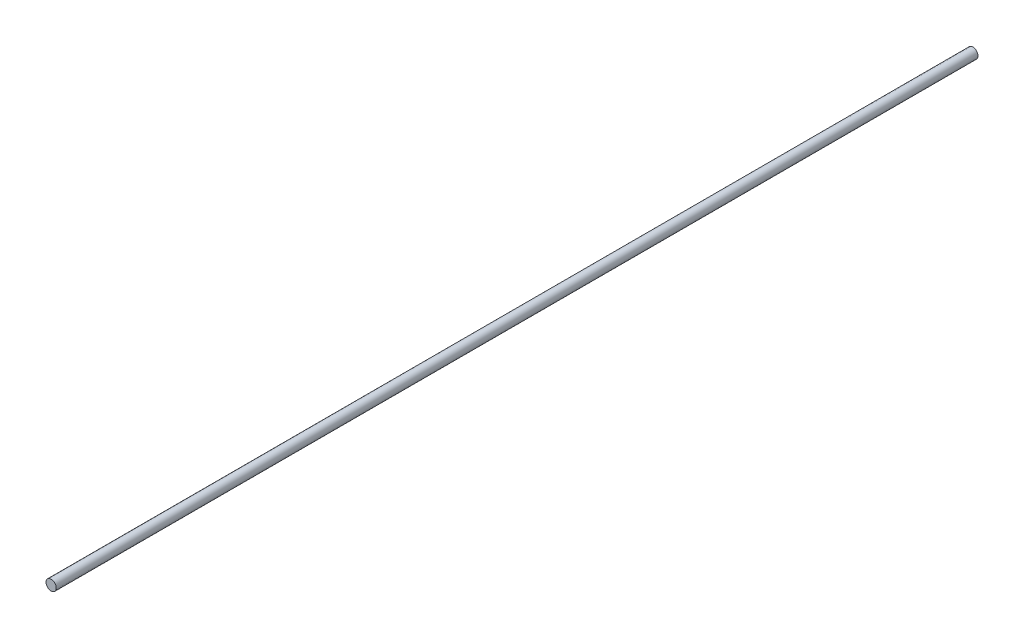
ISO-10303-21;
HEADER;
FILE_DESCRIPTION(('STEP AP214'),'2;1');
FILE_NAME('part.step','',(''),(''),'','','');
FILE_SCHEMA(('AUTOMOTIVE_DESIGN { 1 0 10303 214 1 1 1 1 }'));
ENDSEC;
DATA;
#1=APPLICATION_CONTEXT('core data for automotive mechanical design processes');
#2=APPLICATION_PROTOCOL_DEFINITION('international standard','automotive_design',2000,#1);
#3=PRODUCT_CONTEXT('',#1,'mechanical');
#4=PRODUCT('Part','Part','',(#3));
#5=PRODUCT_RELATED_PRODUCT_CATEGORY('part','',(#4));
#6=PRODUCT_DEFINITION_FORMATION('','',#4);
#7=PRODUCT_DEFINITION_CONTEXT('part definition',#1,'design');
#8=PRODUCT_DEFINITION('design','',#6,#7);
#9=PRODUCT_DEFINITION_SHAPE('','',#8);
#10=(LENGTH_UNIT() NAMED_UNIT(*) SI_UNIT(.MILLI.,.METRE.));
#11=(NAMED_UNIT(*) PLANE_ANGLE_UNIT() SI_UNIT($,.RADIAN.));
#12=(NAMED_UNIT(*) SI_UNIT($,.STERADIAN.) SOLID_ANGLE_UNIT());
#13=UNCERTAINTY_MEASURE_WITH_UNIT(LENGTH_MEASURE(1.E-05),#10,'distance_accuracy_value','');
#14=(GEOMETRIC_REPRESENTATION_CONTEXT(3) GLOBAL_UNCERTAINTY_ASSIGNED_CONTEXT((#13)) GLOBAL_UNIT_ASSIGNED_CONTEXT((#10,
#11,#12)) REPRESENTATION_CONTEXT('',''));
#15=CARTESIAN_POINT('',(0.,0.,0.));
#16=DIRECTION('',(0.,0.,1.));
#17=DIRECTION('',(1.,0.,0.));
#18=AXIS2_PLACEMENT_3D('',#15,#16,#17);
#19=CARTESIAN_POINT('',(0.,0.,180.));
#20=DIRECTION('',(0.,0.,-1.));
#21=DIRECTION('',(-1.,0.,0.));
#22=AXIS2_PLACEMENT_3D('',#19,#20,#21);
#23=CYLINDRICAL_SURFACE('',#22,1.);
#24=CARTESIAN_POINT('',(0.,0.,180.));
#25=DIRECTION('',(0.,0.,1.));
#26=DIRECTION('',(1.,0.,0.));
#27=AXIS2_PLACEMENT_3D('',#24,#25,#26);
#28=CIRCLE('',#27,1.);
#29=CARTESIAN_POINT('',(-1.,0.,180.));
#30=VERTEX_POINT('',#29);
#31=EDGE_CURVE('E10',#30,#30,#28,.T.);
#32=CARTESIAN_POINT('',(0.,0.,0.));
#33=DIRECTION('',(0.,0.,1.));
#34=DIRECTION('',(1.,0.,0.));
#35=AXIS2_PLACEMENT_3D('',#32,#33,#34);
#36=CIRCLE('',#35,1.);
#37=CARTESIAN_POINT('',(-1.,0.,0.));
#38=VERTEX_POINT('',#37);
#39=EDGE_CURVE('E38',#38,#38,#36,.T.);
#40=CARTESIAN_POINT('',(-1.,0.,180.));
#41=CARTESIAN_POINT('',(-1.,0.,178.125));
#42=CARTESIAN_POINT('',(-1.,0.,176.25));
#43=CARTESIAN_POINT('',(-1.,0.,172.5));
#44=CARTESIAN_POINT('',(-1.,0.,170.625));
#45=CARTESIAN_POINT('',(-1.,0.,166.875));
#46=CARTESIAN_POINT('',(-1.,0.,165.));
#47=CARTESIAN_POINT('',(-1.,0.,161.25));
#48=CARTESIAN_POINT('',(-1.,0.,159.375));
#49=CARTESIAN_POINT('',(-1.,0.,155.625));
#50=CARTESIAN_POINT('',(-1.,0.,153.75));
#51=CARTESIAN_POINT('',(-1.,0.,150.));
#52=CARTESIAN_POINT('',(-1.,0.,148.125));
#53=CARTESIAN_POINT('',(-1.,0.,144.375));
#54=CARTESIAN_POINT('',(-1.,0.,142.5));
#55=CARTESIAN_POINT('',(-1.,0.,138.75));
#56=CARTESIAN_POINT('',(-1.,0.,136.875));
#57=CARTESIAN_POINT('',(-1.,0.,133.125));
#58=CARTESIAN_POINT('',(-1.,0.,131.25));
#59=CARTESIAN_POINT('',(-1.,0.,127.5));
#60=CARTESIAN_POINT('',(-1.,0.,125.625));
#61=CARTESIAN_POINT('',(-1.,0.,121.875));
#62=CARTESIAN_POINT('',(-1.,0.,120.));
#63=CARTESIAN_POINT('',(-1.,0.,116.25));
#64=CARTESIAN_POINT('',(-1.,0.,114.375));
#65=CARTESIAN_POINT('',(-1.,0.,110.625));
#66=CARTESIAN_POINT('',(-1.,0.,108.75));
#67=CARTESIAN_POINT('',(-1.,0.,105.));
#68=CARTESIAN_POINT('',(-1.,0.,103.125));
#69=CARTESIAN_POINT('',(-1.,0.,99.375));
#70=CARTESIAN_POINT('',(-1.,0.,97.5));
#71=CARTESIAN_POINT('',(-1.,0.,93.75));
#72=CARTESIAN_POINT('',(-1.,0.,91.875));
#73=CARTESIAN_POINT('',(-1.,0.,88.125));
#74=CARTESIAN_POINT('',(-1.,0.,86.25));
#75=CARTESIAN_POINT('',(-1.,0.,82.5));
#76=CARTESIAN_POINT('',(-1.,0.,80.625));
#77=CARTESIAN_POINT('',(-1.,0.,76.875));
#78=CARTESIAN_POINT('',(-1.,0.,75.));
#79=CARTESIAN_POINT('',(-1.,0.,71.25));
#80=CARTESIAN_POINT('',(-1.,0.,69.375));
#81=CARTESIAN_POINT('',(-1.,0.,65.625));
#82=CARTESIAN_POINT('',(-1.,0.,63.75));
#83=CARTESIAN_POINT('',(-1.,0.,60.));
#84=CARTESIAN_POINT('',(-1.,0.,58.125));
#85=CARTESIAN_POINT('',(-1.,0.,54.375));
#86=CARTESIAN_POINT('',(-1.,0.,52.5));
#87=CARTESIAN_POINT('',(-1.,0.,48.75));
#88=CARTESIAN_POINT('',(-1.,0.,46.875));
#89=CARTESIAN_POINT('',(-1.,0.,43.125));
#90=CARTESIAN_POINT('',(-1.,0.,41.25));
#91=CARTESIAN_POINT('',(-1.,0.,37.5));
#92=CARTESIAN_POINT('',(-1.,0.,35.625));
#93=CARTESIAN_POINT('',(-1.,0.,31.875));
#94=CARTESIAN_POINT('',(-1.,0.,30.));
#95=CARTESIAN_POINT('',(-1.,0.,26.25));
#96=CARTESIAN_POINT('',(-1.,0.,24.375));
#97=CARTESIAN_POINT('',(-1.,0.,20.625));
#98=CARTESIAN_POINT('',(-1.,0.,18.75));
#99=CARTESIAN_POINT('',(-1.,0.,15.));
#100=CARTESIAN_POINT('',(-1.,0.,13.125));
#101=CARTESIAN_POINT('',(-1.,0.,9.37499999999998));
#102=CARTESIAN_POINT('',(-1.,0.,7.49999999999997));
#103=CARTESIAN_POINT('',(-1.,0.,3.74999999999997));
#104=CARTESIAN_POINT('',(-1.,0.,1.87499999999997));
#105=CARTESIAN_POINT('',(-1.,0.,0.));
#106=B_SPLINE_CURVE_WITH_KNOTS('',3,(#40,#41,#42,#43,#44,#45,#46,#47,#48,#49,#50,#51,#52,#53,
#54,#55,#56,#57,#58,#59,#60,#61,#62,#63,#64,#65,#66,#67,#68,#69,#70,#71,#72,#73,#74,#75,#76,#77,
#78,#79,#80,#81,#82,#83,#84,#85,#86,#87,#88,#89,#90,#91,#92,#93,#94,#95,#96,#97,#98,#99,#100,
#101,#102,#103,#104,#105),.UNSPECIFIED.,.F.,.F.,(4,2,2,2,2,2,2,2,2,2,2,2,2,2,2,2,2,2,2,2,2,2,2,
2,2,2,2,2,2,2,2,2,4),(0.,5.62500000000002,11.25,16.875,22.5,28.125,33.75,39.375,45.,50.625,
56.25,61.875,67.5,73.125,78.75,84.375,90.,95.625,101.25,106.875,112.5,118.125,123.75,129.375,
135.,140.625,146.25,151.875,157.5,163.125,168.75,174.375,180.),.UNSPECIFIED.);
#107=EDGE_CURVE('BSEAM35',#30,#38,#106,.T.);
#108=ORIENTED_EDGE('',*,*,#31,.F.);
#109=ORIENTED_EDGE('',*,*,#39,.T.);
#110=ORIENTED_EDGE('',*,*,#107,.T.);
#111=ORIENTED_EDGE('',*,*,#107,.F.);
#112=EDGE_LOOP('',(#108,#110,#109,#111));
#113=FACE_BOUND('',#112,.T.);
#114=ADVANCED_FACE('F35',(#113),#23,.T.);
#115=CARTESIAN_POINT('',(0.,0.,180.));
#116=DIRECTION('',(0.,0.,1.));
#117=DIRECTION('',(1.,0.,0.));
#118=AXIS2_PLACEMENT_3D('',#115,#116,#117);
#119=PLANE('',#118);
#120=ORIENTED_EDGE('',*,*,#31,.T.);
#121=EDGE_LOOP('',(#120));
#122=FACE_BOUND('',#121,.T.);
#123=ADVANCED_FACE('F50',(#122),#119,.T.);
#124=CARTESIAN_POINT('',(0.,0.,0.));
#125=DIRECTION('',(0.,0.,1.));
#126=DIRECTION('',(1.,0.,0.));
#127=AXIS2_PLACEMENT_3D('',#124,#125,#126);
#128=PLANE('',#127);
#129=ORIENTED_EDGE('',*,*,#39,.F.);
#130=EDGE_LOOP('',(#129));
#131=FACE_BOUND('',#130,.T.);
#132=ADVANCED_FACE('F48',(#131),#128,.F.);
#133=CLOSED_SHELL('',(#114,#123,#132));
#134=MANIFOLD_SOLID_BREP('B2',#133);
#135=ADVANCED_BREP_SHAPE_REPRESENTATION('',(#18,#134),#14);
#136=SHAPE_DEFINITION_REPRESENTATION(#9,#135);
ENDSEC;
END-ISO-10303-21;
